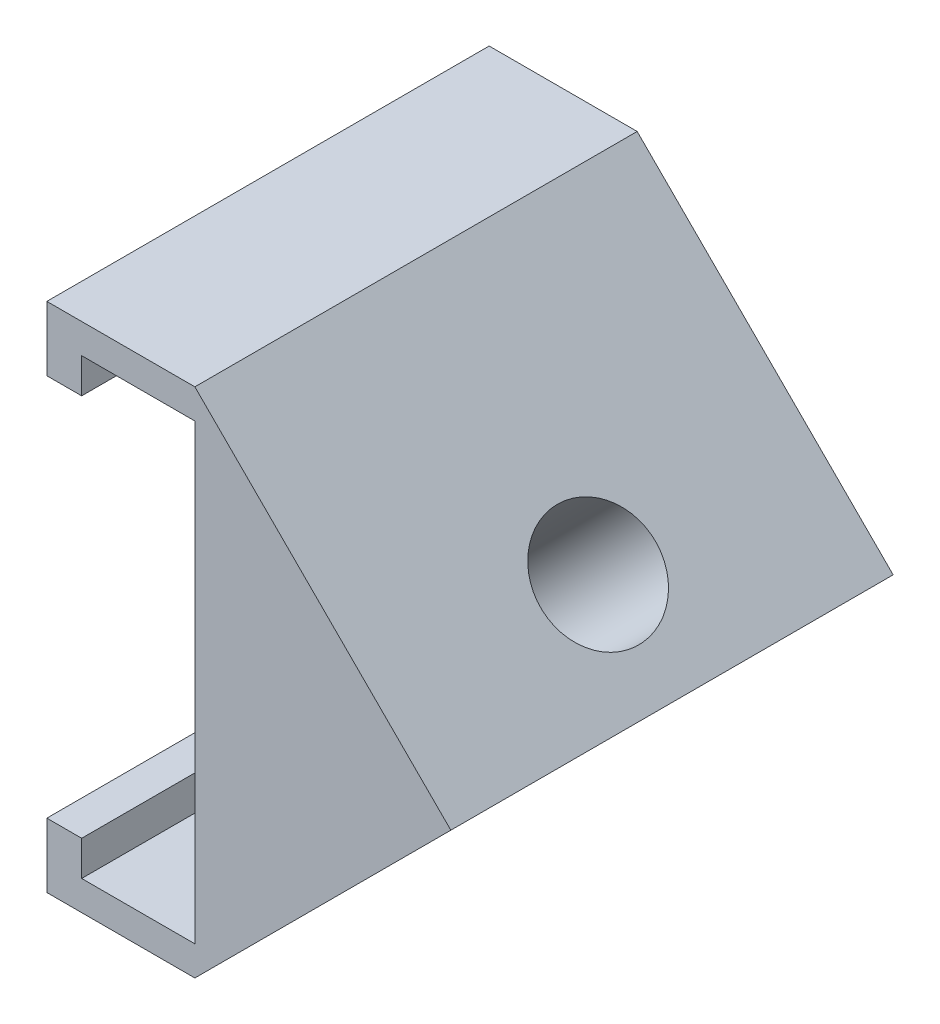
ISO-10303-21;
HEADER;
FILE_DESCRIPTION(('STEP AP214'),'2;1');
FILE_NAME('part.step','',(''),(''),'','','');
FILE_SCHEMA(('AUTOMOTIVE_DESIGN { 1 0 10303 214 1 1 1 1 }'));
ENDSEC;
DATA;
#1=APPLICATION_CONTEXT('core data for automotive mechanical design processes');
#2=APPLICATION_PROTOCOL_DEFINITION('international standard','automotive_design',2000,#1);
#3=PRODUCT_CONTEXT('',#1,'mechanical');
#4=PRODUCT('Part','Part','',(#3));
#5=PRODUCT_RELATED_PRODUCT_CATEGORY('part','',(#4));
#6=PRODUCT_DEFINITION_FORMATION('','',#4);
#7=PRODUCT_DEFINITION_CONTEXT('part definition',#1,'design');
#8=PRODUCT_DEFINITION('design','',#6,#7);
#9=PRODUCT_DEFINITION_SHAPE('','',#8);
#10=(LENGTH_UNIT() NAMED_UNIT(*) SI_UNIT(.MILLI.,.METRE.));
#11=(NAMED_UNIT(*) PLANE_ANGLE_UNIT() SI_UNIT($,.RADIAN.));
#12=(NAMED_UNIT(*) SI_UNIT($,.STERADIAN.) SOLID_ANGLE_UNIT());
#13=UNCERTAINTY_MEASURE_WITH_UNIT(LENGTH_MEASURE(1.E-05),#10,'distance_accuracy_value','');
#14=(GEOMETRIC_REPRESENTATION_CONTEXT(3) GLOBAL_UNCERTAINTY_ASSIGNED_CONTEXT((#13)) GLOBAL_UNIT_ASSIGNED_CONTEXT((#10,
#11,#12)) REPRESENTATION_CONTEXT('',''));
#15=CARTESIAN_POINT('',(0.,0.,0.));
#16=DIRECTION('',(0.,0.,1.));
#17=DIRECTION('',(1.,0.,0.));
#18=AXIS2_PLACEMENT_3D('',#15,#16,#17);
#19=CARTESIAN_POINT('',(0.,0.,12.7));
#20=DIRECTION('',(-0.707106781186522,0.707106781186573,0.));
#21=DIRECTION('',(-0.707106781186573,-0.707106781186522,0.));
#22=AXIS2_PLACEMENT_3D('',#19,#20,#21);
#23=PLANE('',#22);
#24=DIRECTION('',(0.707106781186573,0.707106781186522,0.));
#25=VECTOR('',#24,1.);
#26=CARTESIAN_POINT('',(0.,0.,0.));
#27=LINE('',#26,#25);
#28=CARTESIAN_POINT('',(-7.35,-7.34999999999948,0.));
#29=VERTEX_POINT('',#28);
#30=CARTESIAN_POINT('',(0.,0.,0.));
#31=VERTEX_POINT('',#30);
#32=EDGE_CURVE('E162',#29,#31,#27,.T.);
#33=ORIENTED_EDGE('',*,*,#32,.T.);
#34=DIRECTION('',(0.,0.,-1.));
#35=VECTOR('',#34,1.);
#36=CARTESIAN_POINT('',(0.,0.,12.7));
#37=LINE('',#36,#35);
#38=CARTESIAN_POINT('',(0.,0.,12.7));
#39=VERTEX_POINT('',#38);
#40=EDGE_CURVE('E11',#39,#31,#37,.T.);
#41=ORIENTED_EDGE('',*,*,#40,.F.);
#42=DIRECTION('',(0.707106781186573,0.707106781186522,0.));
#43=VECTOR('',#42,1.);
#44=CARTESIAN_POINT('',(0.,0.,12.7));
#45=LINE('',#44,#43);
#46=CARTESIAN_POINT('',(-7.35,-7.34999999999948,12.7));
#47=VERTEX_POINT('',#46);
#48=EDGE_CURVE('E188',#47,#39,#45,.T.);
#49=ORIENTED_EDGE('',*,*,#48,.F.);
#50=DIRECTION('',(0.,0.,-1.));
#51=VECTOR('',#50,1.);
#52=CARTESIAN_POINT('',(-7.35,-7.34999999999948,12.7));
#53=LINE('',#52,#51);
#54=EDGE_CURVE('E158',#47,#29,#53,.T.);
#55=ORIENTED_EDGE('',*,*,#54,.T.);
#56=EDGE_LOOP('',(#33,#41,#49,#55));
#57=FACE_BOUND('',#56,.T.);
#58=ADVANCED_FACE('F36',(#57),#23,.F.);
#59=CARTESIAN_POINT('',(-7.35,7.35000000000052,12.7));
#60=DIRECTION('',(-0.707106781186573,-0.707106781186523,0.));
#61=DIRECTION('',(0.707106781186523,-0.707106781186573,0.));
#62=AXIS2_PLACEMENT_3D('',#59,#60,#61);
#63=PLANE('',#62);
#64=CARTESIAN_POINT('',(-2.12132034355957,2.12132034355972,6.35));
#65=DIRECTION('',(0.707106781186572,0.707106781186523,0.));
#66=DIRECTION('',(-0.707106781186523,0.707106781186572,0.));
#67=AXIS2_PLACEMENT_3D('',#64,#65,#66);
#68=CIRCLE('',#67,1.65);
#69=CARTESIAN_POINT('',(-3.28804653251733,3.28804653251756,6.35));
#70=VERTEX_POINT('',#69);
#71=EDGE_CURVE('E360',#70,#70,#68,.T.);
#72=ORIENTED_EDGE('',*,*,#71,.F.);
#73=EDGE_LOOP('',(#72));
#74=FACE_BOUND('',#73,.T.);
#75=DIRECTION('',(-0.707106781186522,0.707106781186572,0.));
#76=VECTOR('',#75,1.);
#77=CARTESIAN_POINT('',(-7.35,7.35000000000052,0.));
#78=LINE('',#77,#76);
#79=CARTESIAN_POINT('',(-7.35,7.35000000000052,0.));
#80=VERTEX_POINT('',#79);
#81=EDGE_CURVE('E165',#31,#80,#78,.T.);
#82=ORIENTED_EDGE('',*,*,#81,.T.);
#83=DIRECTION('',(0.,0.,-1.));
#84=VECTOR('',#83,1.);
#85=CARTESIAN_POINT('',(-7.35,7.35000000000052,12.7));
#86=LINE('',#85,#84);
#87=CARTESIAN_POINT('',(-7.35,7.35000000000052,12.7));
#88=VERTEX_POINT('',#87);
#89=EDGE_CURVE('E44',#88,#80,#86,.T.);
#90=ORIENTED_EDGE('',*,*,#89,.F.);
#91=DIRECTION('',(-0.707106781186522,0.707106781186572,0.));
#92=VECTOR('',#91,1.);
#93=CARTESIAN_POINT('',(-7.35,7.35000000000052,12.7));
#94=LINE('',#93,#92);
#95=EDGE_CURVE('E109',#39,#88,#94,.T.);
#96=ORIENTED_EDGE('',*,*,#95,.F.);
#97=ORIENTED_EDGE('',*,*,#40,.T.);
#98=EDGE_LOOP('',(#82,#90,#96,#97));
#99=FACE_BOUND('',#98,.T.);
#100=ADVANCED_FACE('F270',(#74,#99),#63,.F.);
#101=CARTESIAN_POINT('',(-11.6,7.35000000000052,12.7));
#102=DIRECTION('',(0.,-1.,0.));
#103=DIRECTION('',(1.,0.,0.));
#104=AXIS2_PLACEMENT_3D('',#101,#102,#103);
#105=PLANE('',#104);
#106=DIRECTION('',(-1.,0.,0.));
#107=VECTOR('',#106,1.);
#108=CARTESIAN_POINT('',(-11.6,7.35000000000052,0.));
#109=LINE('',#108,#107);
#110=CARTESIAN_POINT('',(-11.6,7.35000000000052,0.));
#111=VERTEX_POINT('',#110);
#112=EDGE_CURVE('E168',#80,#111,#109,.T.);
#113=ORIENTED_EDGE('',*,*,#112,.T.);
#114=DIRECTION('',(0.,0.,-1.));
#115=VECTOR('',#114,1.);
#116=CARTESIAN_POINT('',(-11.6,7.35000000000052,12.7));
#117=LINE('',#116,#115);
#118=CARTESIAN_POINT('',(-11.6,7.35000000000052,12.7));
#119=VERTEX_POINT('',#118);
#120=EDGE_CURVE('E210',#119,#111,#117,.T.);
#121=ORIENTED_EDGE('',*,*,#120,.F.);
#122=DIRECTION('',(-1.,0.,0.));
#123=VECTOR('',#122,1.);
#124=CARTESIAN_POINT('',(-11.6,7.35000000000052,12.7));
#125=LINE('',#124,#123);
#126=EDGE_CURVE('E218',#88,#119,#125,.T.);
#127=ORIENTED_EDGE('',*,*,#126,.F.);
#128=ORIENTED_EDGE('',*,*,#89,.T.);
#129=EDGE_LOOP('',(#113,#121,#127,#128));
#130=FACE_BOUND('',#129,.T.);
#131=ADVANCED_FACE('F216',(#130),#105,.F.);
#132=CARTESIAN_POINT('',(-11.6,6.5,12.7));
#133=DIRECTION('',(1.,0.,0.));
#134=DIRECTION('',(0.,1.,0.));
#135=AXIS2_PLACEMENT_3D('',#132,#133,#134);
#136=PLANE('',#135);
#137=DIRECTION('',(0.,-1.,0.));
#138=VECTOR('',#137,1.);
#139=CARTESIAN_POINT('',(-11.6,6.5,0.));
#140=LINE('',#139,#138);
#141=CARTESIAN_POINT('',(-11.6,5.5,0.));
#142=VERTEX_POINT('',#141);
#143=EDGE_CURVE('E171',#111,#142,#140,.T.);
#144=ORIENTED_EDGE('',*,*,#143,.T.);
#145=DIRECTION('',(0.,0.,-1.));
#146=VECTOR('',#145,1.);
#147=CARTESIAN_POINT('',(-11.6,5.5,12.7));
#148=LINE('',#147,#146);
#149=CARTESIAN_POINT('',(-11.6,5.5,12.7));
#150=VERTEX_POINT('',#149);
#151=EDGE_CURVE('E207',#150,#142,#148,.T.);
#152=ORIENTED_EDGE('',*,*,#151,.F.);
#153=DIRECTION('',(0.,-1.,0.));
#154=VECTOR('',#153,1.);
#155=CARTESIAN_POINT('',(-11.6,7.35000000000052,12.7));
#156=LINE('',#155,#154);
#157=EDGE_CURVE('E235',#119,#150,#156,.T.);
#158=ORIENTED_EDGE('',*,*,#157,.F.);
#159=ORIENTED_EDGE('',*,*,#120,.T.);
#160=EDGE_LOOP('',(#144,#152,#158,#159));
#161=FACE_BOUND('',#160,.T.);
#162=ADVANCED_FACE('F226',(#161),#136,.F.);
#163=CARTESIAN_POINT('',(-11.6,5.5,12.7));
#164=DIRECTION('',(0.,1.,0.));
#165=DIRECTION('',(-1.,0.,0.));
#166=AXIS2_PLACEMENT_3D('',#163,#164,#165);
#167=PLANE('',#166);
#168=DIRECTION('',(1.,0.,0.));
#169=VECTOR('',#168,1.);
#170=CARTESIAN_POINT('',(-11.6,5.5,0.));
#171=LINE('',#170,#169);
#172=CARTESIAN_POINT('',(-10.6,5.5,0.));
#173=VERTEX_POINT('',#172);
#174=EDGE_CURVE('E173',#142,#173,#171,.T.);
#175=ORIENTED_EDGE('',*,*,#174,.T.);
#176=DIRECTION('',(0.,0.,-1.));
#177=VECTOR('',#176,1.);
#178=CARTESIAN_POINT('',(-10.6,5.5,12.7));
#179=LINE('',#178,#177);
#180=CARTESIAN_POINT('',(-10.6,5.5,12.7));
#181=VERTEX_POINT('',#180);
#182=EDGE_CURVE('E204',#181,#173,#179,.T.);
#183=ORIENTED_EDGE('',*,*,#182,.F.);
#184=DIRECTION('',(1.,0.,0.));
#185=VECTOR('',#184,1.);
#186=CARTESIAN_POINT('',(-11.6,5.5,12.7));
#187=LINE('',#186,#185);
#188=EDGE_CURVE('E232',#150,#181,#187,.T.);
#189=ORIENTED_EDGE('',*,*,#188,.F.);
#190=ORIENTED_EDGE('',*,*,#151,.T.);
#191=EDGE_LOOP('',(#175,#183,#189,#190));
#192=FACE_BOUND('',#191,.T.);
#193=ADVANCED_FACE('F230',(#192),#167,.F.);
#194=CARTESIAN_POINT('',(-10.6,6.5,12.7));
#195=DIRECTION('',(-1.,0.,0.));
#196=DIRECTION('',(0.,0.,1.));
#197=AXIS2_PLACEMENT_3D('',#194,#195,#196);
#198=PLANE('',#197);
#199=DIRECTION('',(0.,1.,0.));
#200=VECTOR('',#199,1.);
#201=CARTESIAN_POINT('',(-10.6,6.5,0.));
#202=LINE('',#201,#200);
#203=CARTESIAN_POINT('',(-10.6,6.5,0.));
#204=VERTEX_POINT('',#203);
#205=EDGE_CURVE('E175',#173,#204,#202,.T.);
#206=ORIENTED_EDGE('',*,*,#205,.T.);
#207=DIRECTION('',(0.,0.,-1.));
#208=VECTOR('',#207,1.);
#209=CARTESIAN_POINT('',(-10.6,6.5,12.7));
#210=LINE('',#209,#208);
#211=CARTESIAN_POINT('',(-10.6,6.5,12.7));
#212=VERTEX_POINT('',#211);
#213=EDGE_CURVE('E201',#212,#204,#210,.T.);
#214=ORIENTED_EDGE('',*,*,#213,.F.);
#215=DIRECTION('',(0.,1.,0.));
#216=VECTOR('',#215,1.);
#217=CARTESIAN_POINT('',(-10.6,6.5,12.7));
#218=LINE('',#217,#216);
#219=EDGE_CURVE('E234',#181,#212,#218,.T.);
#220=ORIENTED_EDGE('',*,*,#219,.F.);
#221=ORIENTED_EDGE('',*,*,#182,.T.);
#222=EDGE_LOOP('',(#206,#214,#220,#221));
#223=FACE_BOUND('',#222,.T.);
#224=ADVANCED_FACE('F285',(#223),#198,.F.);
#225=CARTESIAN_POINT('',(-10.6,6.5,12.7));
#226=DIRECTION('',(0.,1.,0.));
#227=DIRECTION('',(-1.,0.,0.));
#228=AXIS2_PLACEMENT_3D('',#225,#226,#227);
#229=PLANE('',#228);
#230=DIRECTION('',(1.,0.,0.));
#231=VECTOR('',#230,1.);
#232=CARTESIAN_POINT('',(-10.6,6.5,0.));
#233=LINE('',#232,#231);
#234=CARTESIAN_POINT('',(-7.35,6.5,0.));
#235=VERTEX_POINT('',#234);
#236=EDGE_CURVE('E177',#204,#235,#233,.T.);
#237=ORIENTED_EDGE('',*,*,#236,.T.);
#238=DIRECTION('',(0.,0.,-1.));
#239=VECTOR('',#238,1.);
#240=CARTESIAN_POINT('',(-7.35,6.5,12.7));
#241=LINE('',#240,#239);
#242=CARTESIAN_POINT('',(-7.35,6.5,12.7));
#243=VERTEX_POINT('',#242);
#244=EDGE_CURVE('E198',#243,#235,#241,.T.);
#245=ORIENTED_EDGE('',*,*,#244,.F.);
#246=DIRECTION('',(1.,0.,0.));
#247=VECTOR('',#246,1.);
#248=CARTESIAN_POINT('',(-10.6,6.5,12.7));
#249=LINE('',#248,#247);
#250=EDGE_CURVE('E237',#212,#243,#249,.T.);
#251=ORIENTED_EDGE('',*,*,#250,.F.);
#252=ORIENTED_EDGE('',*,*,#213,.T.);
#253=EDGE_LOOP('',(#237,#245,#251,#252));
#254=FACE_BOUND('',#253,.T.);
#255=ADVANCED_FACE('F288',(#254),#229,.F.);
#256=CARTESIAN_POINT('',(-7.35,6.5,12.7));
#257=DIRECTION('',(1.,0.,0.));
#258=DIRECTION('',(0.,1.,0.));
#259=AXIS2_PLACEMENT_3D('',#256,#257,#258);
#260=PLANE('',#259);
#261=DIRECTION('',(0.,-1.,0.));
#262=VECTOR('',#261,1.);
#263=CARTESIAN_POINT('',(-7.35,6.5,0.));
#264=LINE('',#263,#262);
#265=CARTESIAN_POINT('',(-7.35,-6.5,0.));
#266=VERTEX_POINT('',#265);
#267=EDGE_CURVE('E179',#235,#266,#264,.T.);
#268=ORIENTED_EDGE('',*,*,#267,.T.);
#269=DIRECTION('',(0.,0.,-1.));
#270=VECTOR('',#269,1.);
#271=CARTESIAN_POINT('',(-7.35,-6.5,12.7));
#272=LINE('',#271,#270);
#273=CARTESIAN_POINT('',(-7.35,-6.5,12.7));
#274=VERTEX_POINT('',#273);
#275=EDGE_CURVE('E195',#274,#266,#272,.T.);
#276=ORIENTED_EDGE('',*,*,#275,.F.);
#277=DIRECTION('',(0.,-1.,0.));
#278=VECTOR('',#277,1.);
#279=CARTESIAN_POINT('',(-7.35,6.5,12.7));
#280=LINE('',#279,#278);
#281=EDGE_CURVE('E243',#243,#274,#280,.T.);
#282=ORIENTED_EDGE('',*,*,#281,.F.);
#283=ORIENTED_EDGE('',*,*,#244,.T.);
#284=EDGE_LOOP('',(#268,#276,#282,#283));
#285=FACE_BOUND('',#284,.T.);
#286=ADVANCED_FACE('F292',(#285),#260,.F.);
#287=CARTESIAN_POINT('',(-10.6,-6.5,12.7));
#288=DIRECTION('',(0.,-1.,0.));
#289=DIRECTION('',(1.,0.,0.));
#290=AXIS2_PLACEMENT_3D('',#287,#288,#289);
#291=PLANE('',#290);
#292=DIRECTION('',(-1.,0.,0.));
#293=VECTOR('',#292,1.);
#294=CARTESIAN_POINT('',(-10.6,-6.5,0.));
#295=LINE('',#294,#293);
#296=CARTESIAN_POINT('',(-10.6,-6.5,0.));
#297=VERTEX_POINT('',#296);
#298=EDGE_CURVE('E181',#266,#297,#295,.T.);
#299=ORIENTED_EDGE('',*,*,#298,.T.);
#300=DIRECTION('',(0.,0.,-1.));
#301=VECTOR('',#300,1.);
#302=CARTESIAN_POINT('',(-10.6,-6.5,12.7));
#303=LINE('',#302,#301);
#304=CARTESIAN_POINT('',(-10.6,-6.5,12.7));
#305=VERTEX_POINT('',#304);
#306=EDGE_CURVE('E192',#305,#297,#303,.T.);
#307=ORIENTED_EDGE('',*,*,#306,.F.);
#308=DIRECTION('',(-1.,0.,0.));
#309=VECTOR('',#308,1.);
#310=CARTESIAN_POINT('',(-10.6,-6.5,12.7));
#311=LINE('',#310,#309);
#312=EDGE_CURVE('E245',#274,#305,#311,.T.);
#313=ORIENTED_EDGE('',*,*,#312,.F.);
#314=ORIENTED_EDGE('',*,*,#275,.T.);
#315=EDGE_LOOP('',(#299,#307,#313,#314));
#316=FACE_BOUND('',#315,.T.);
#317=ADVANCED_FACE('F251',(#316),#291,.F.);
#318=CARTESIAN_POINT('',(-10.6,-6.5,12.7));
#319=DIRECTION('',(-1.,0.,0.));
#320=DIRECTION('',(0.,0.,1.));
#321=AXIS2_PLACEMENT_3D('',#318,#319,#320);
#322=PLANE('',#321);
#323=DIRECTION('',(0.,1.,0.));
#324=VECTOR('',#323,1.);
#325=CARTESIAN_POINT('',(-10.6,-6.5,0.));
#326=LINE('',#325,#324);
#327=CARTESIAN_POINT('',(-10.6,-5.5,0.));
#328=VERTEX_POINT('',#327);
#329=EDGE_CURVE('E183',#297,#328,#326,.T.);
#330=ORIENTED_EDGE('',*,*,#329,.T.);
#331=DIRECTION('',(0.,0.,-1.));
#332=VECTOR('',#331,1.);
#333=CARTESIAN_POINT('',(-10.6,-5.5,12.7));
#334=LINE('',#333,#332);
#335=CARTESIAN_POINT('',(-10.6,-5.5,12.7));
#336=VERTEX_POINT('',#335);
#337=EDGE_CURVE('E153',#336,#328,#334,.T.);
#338=ORIENTED_EDGE('',*,*,#337,.F.);
#339=DIRECTION('',(0.,1.,0.));
#340=VECTOR('',#339,1.);
#341=CARTESIAN_POINT('',(-10.6,-6.5,12.7));
#342=LINE('',#341,#340);
#343=EDGE_CURVE('E143',#305,#336,#342,.T.);
#344=ORIENTED_EDGE('',*,*,#343,.F.);
#345=ORIENTED_EDGE('',*,*,#306,.T.);
#346=EDGE_LOOP('',(#330,#338,#344,#345));
#347=FACE_BOUND('',#346,.T.);
#348=ADVANCED_FACE('F255',(#347),#322,.F.);
#349=CARTESIAN_POINT('',(-11.6,-5.5,12.7));
#350=DIRECTION('',(0.,-1.,0.));
#351=DIRECTION('',(0.,0.,-1.));
#352=AXIS2_PLACEMENT_3D('',#349,#350,#351);
#353=PLANE('',#352);
#354=DIRECTION('',(-1.,0.,0.));
#355=VECTOR('',#354,1.);
#356=CARTESIAN_POINT('',(-11.6,-5.5,0.));
#357=LINE('',#356,#355);
#358=CARTESIAN_POINT('',(-11.6,-5.5,0.));
#359=VERTEX_POINT('',#358);
#360=EDGE_CURVE('E152',#328,#359,#357,.T.);
#361=ORIENTED_EDGE('',*,*,#360,.T.);
#362=DIRECTION('',(0.,0.,-1.));
#363=VECTOR('',#362,1.);
#364=CARTESIAN_POINT('',(-11.6,-5.5,12.7));
#365=LINE('',#364,#363);
#366=CARTESIAN_POINT('',(-11.6,-5.5,12.7));
#367=VERTEX_POINT('',#366);
#368=EDGE_CURVE('E149',#367,#359,#365,.T.);
#369=ORIENTED_EDGE('',*,*,#368,.F.);
#370=DIRECTION('',(-1.,0.,0.));
#371=VECTOR('',#370,1.);
#372=CARTESIAN_POINT('',(-11.6,-5.5,12.7));
#373=LINE('',#372,#371);
#374=EDGE_CURVE('E137',#336,#367,#373,.T.);
#375=ORIENTED_EDGE('',*,*,#374,.F.);
#376=ORIENTED_EDGE('',*,*,#337,.T.);
#377=EDGE_LOOP('',(#361,#369,#375,#376));
#378=FACE_BOUND('',#377,.T.);
#379=ADVANCED_FACE('F150',(#378),#353,.F.);
#380=CARTESIAN_POINT('',(-11.6,-6.5,12.7));
#381=DIRECTION('',(1.,0.,0.));
#382=DIRECTION('',(0.,1.,0.));
#383=AXIS2_PLACEMENT_3D('',#380,#381,#382);
#384=PLANE('',#383);
#385=DIRECTION('',(0.,-1.,0.));
#386=VECTOR('',#385,1.);
#387=CARTESIAN_POINT('',(-11.6,-6.5,0.));
#388=LINE('',#387,#386);
#389=CARTESIAN_POINT('',(-11.6,-7.34999999999948,0.));
#390=VERTEX_POINT('',#389);
#391=EDGE_CURVE('E95',#359,#390,#388,.T.);
#392=ORIENTED_EDGE('',*,*,#391,.T.);
#393=DIRECTION('',(0.,0.,-1.));
#394=VECTOR('',#393,1.);
#395=CARTESIAN_POINT('',(-11.6,-7.34999999999948,12.7));
#396=LINE('',#395,#394);
#397=CARTESIAN_POINT('',(-11.6,-7.34999999999948,12.7));
#398=VERTEX_POINT('',#397);
#399=EDGE_CURVE('E154',#398,#390,#396,.T.);
#400=ORIENTED_EDGE('',*,*,#399,.F.);
#401=DIRECTION('',(0.,-1.,0.));
#402=VECTOR('',#401,1.);
#403=CARTESIAN_POINT('',(-11.6,-6.5,12.7));
#404=LINE('',#403,#402);
#405=EDGE_CURVE('E141',#367,#398,#404,.T.);
#406=ORIENTED_EDGE('',*,*,#405,.F.);
#407=ORIENTED_EDGE('',*,*,#368,.T.);
#408=EDGE_LOOP('',(#392,#400,#406,#407));
#409=FACE_BOUND('',#408,.T.);
#410=ADVANCED_FACE('F156',(#409),#384,.F.);
#411=CARTESIAN_POINT('',(-11.6,-7.34999999999948,12.7));
#412=DIRECTION('',(0.,1.,0.));
#413=DIRECTION('',(0.,0.,1.));
#414=AXIS2_PLACEMENT_3D('',#411,#412,#413);
#415=PLANE('',#414);
#416=DIRECTION('',(1.,0.,0.));
#417=VECTOR('',#416,1.);
#418=CARTESIAN_POINT('',(-11.6,-7.34999999999948,0.));
#419=LINE('',#418,#417);
#420=EDGE_CURVE('E101',#390,#29,#419,.T.);
#421=ORIENTED_EDGE('',*,*,#420,.T.);
#422=ORIENTED_EDGE('',*,*,#54,.F.);
#423=DIRECTION('',(1.,0.,0.));
#424=VECTOR('',#423,1.);
#425=CARTESIAN_POINT('',(-11.6,-7.34999999999948,12.7));
#426=LINE('',#425,#424);
#427=EDGE_CURVE('E52',#398,#47,#426,.T.);
#428=ORIENTED_EDGE('',*,*,#427,.F.);
#429=ORIENTED_EDGE('',*,*,#399,.T.);
#430=EDGE_LOOP('',(#421,#422,#428,#429));
#431=FACE_BOUND('',#430,.T.);
#432=ADVANCED_FACE('F259',(#431),#415,.F.);
#433=CARTESIAN_POINT('',(0.,0.,12.7));
#434=DIRECTION('',(0.,0.,1.));
#435=DIRECTION('',(1.,0.,0.));
#436=AXIS2_PLACEMENT_3D('',#433,#434,#435);
#437=PLANE('',#436);
#438=ORIENTED_EDGE('',*,*,#48,.T.);
#439=ORIENTED_EDGE('',*,*,#95,.T.);
#440=ORIENTED_EDGE('',*,*,#126,.T.);
#441=ORIENTED_EDGE('',*,*,#157,.T.);
#442=ORIENTED_EDGE('',*,*,#188,.T.);
#443=ORIENTED_EDGE('',*,*,#219,.T.);
#444=ORIENTED_EDGE('',*,*,#250,.T.);
#445=ORIENTED_EDGE('',*,*,#281,.T.);
#446=ORIENTED_EDGE('',*,*,#312,.T.);
#447=ORIENTED_EDGE('',*,*,#343,.T.);
#448=ORIENTED_EDGE('',*,*,#374,.T.);
#449=ORIENTED_EDGE('',*,*,#405,.T.);
#450=ORIENTED_EDGE('',*,*,#427,.T.);
#451=EDGE_LOOP('',(#438,#439,#440,#441,#442,#443,#444,#445,#446,#447,#448,#449,#450));
#452=FACE_BOUND('',#451,.T.);
#453=ADVANCED_FACE('F139',(#452),#437,.T.);
#454=CARTESIAN_POINT('',(0.,0.,0.));
#455=DIRECTION('',(0.,0.,1.));
#456=DIRECTION('',(1.,0.,0.));
#457=AXIS2_PLACEMENT_3D('',#454,#455,#456);
#458=PLANE('',#457);
#459=ORIENTED_EDGE('',*,*,#32,.F.);
#460=ORIENTED_EDGE('',*,*,#420,.F.);
#461=ORIENTED_EDGE('',*,*,#391,.F.);
#462=ORIENTED_EDGE('',*,*,#360,.F.);
#463=ORIENTED_EDGE('',*,*,#329,.F.);
#464=ORIENTED_EDGE('',*,*,#298,.F.);
#465=ORIENTED_EDGE('',*,*,#267,.F.);
#466=ORIENTED_EDGE('',*,*,#236,.F.);
#467=ORIENTED_EDGE('',*,*,#205,.F.);
#468=ORIENTED_EDGE('',*,*,#174,.F.);
#469=ORIENTED_EDGE('',*,*,#143,.F.);
#470=ORIENTED_EDGE('',*,*,#112,.F.);
#471=ORIENTED_EDGE('',*,*,#81,.F.);
#472=EDGE_LOOP('',(#459,#460,#461,#462,#463,#464,#465,#466,#467,#468,#469,#470,#471));
#473=FACE_BOUND('',#472,.T.);
#474=ADVANCED_FACE('F221',(#473),#458,.F.);
#475=CARTESIAN_POINT('',(-5.65685424949243,-1.4142135623729,6.35));
#476=DIRECTION('',(0.707106781186572,0.707106781186523,0.));
#477=DIRECTION('',(-0.707106781186523,0.707106781186572,0.));
#478=AXIS2_PLACEMENT_3D('',#475,#476,#477);
#479=CYLINDRICAL_SURFACE('',#478,1.65);
#480=CARTESIAN_POINT('',(-5.65685424949243,-1.4142135623729,6.35));
#481=DIRECTION('',(0.707106781186572,0.707106781186523,0.));
#482=DIRECTION('',(-0.707106781186523,0.707106781186572,0.));
#483=AXIS2_PLACEMENT_3D('',#480,#481,#482);
#484=CIRCLE('',#483,1.65);
#485=CARTESIAN_POINT('',(-6.82358043845019,-0.24748737341505,6.35));
#486=VERTEX_POINT('',#485);
#487=EDGE_CURVE('E166',#486,#486,#484,.T.);
#488=ORIENTED_EDGE('',*,*,#487,.F.);
#489=EDGE_LOOP('',(#488));
#490=FACE_BOUND('',#489,.T.);
#491=ORIENTED_EDGE('',*,*,#71,.T.);
#492=EDGE_LOOP('',(#491));
#493=FACE_BOUND('',#492,.T.);
#494=ADVANCED_FACE('F329',(#490,#493),#479,.F.);
#495=CARTESIAN_POINT('',(-5.65685424949243,-1.4142135623729,6.35));
#496=DIRECTION('',(0.707106781186572,0.707106781186523,0.));
#497=DIRECTION('',(-0.707106781186523,0.707106781186572,0.));
#498=AXIS2_PLACEMENT_3D('',#495,#496,#497);
#499=PLANE('',#498);
#500=ORIENTED_EDGE('',*,*,#487,.T.);
#501=EDGE_LOOP('',(#500));
#502=FACE_BOUND('',#501,.T.);
#503=ADVANCED_FACE('F344',(#502),#499,.T.);
#504=CLOSED_SHELL('',(#58,#100,#131,#162,#193,#224,#255,#286,#317,#348,#379,#410,#432,#453,#474,
#494,#503));
#505=MANIFOLD_SOLID_BREP('B2',#504);
#506=ADVANCED_BREP_SHAPE_REPRESENTATION('',(#18,#505),#14);
#507=SHAPE_DEFINITION_REPRESENTATION(#9,#506);
ENDSEC;
END-ISO-10303-21;
